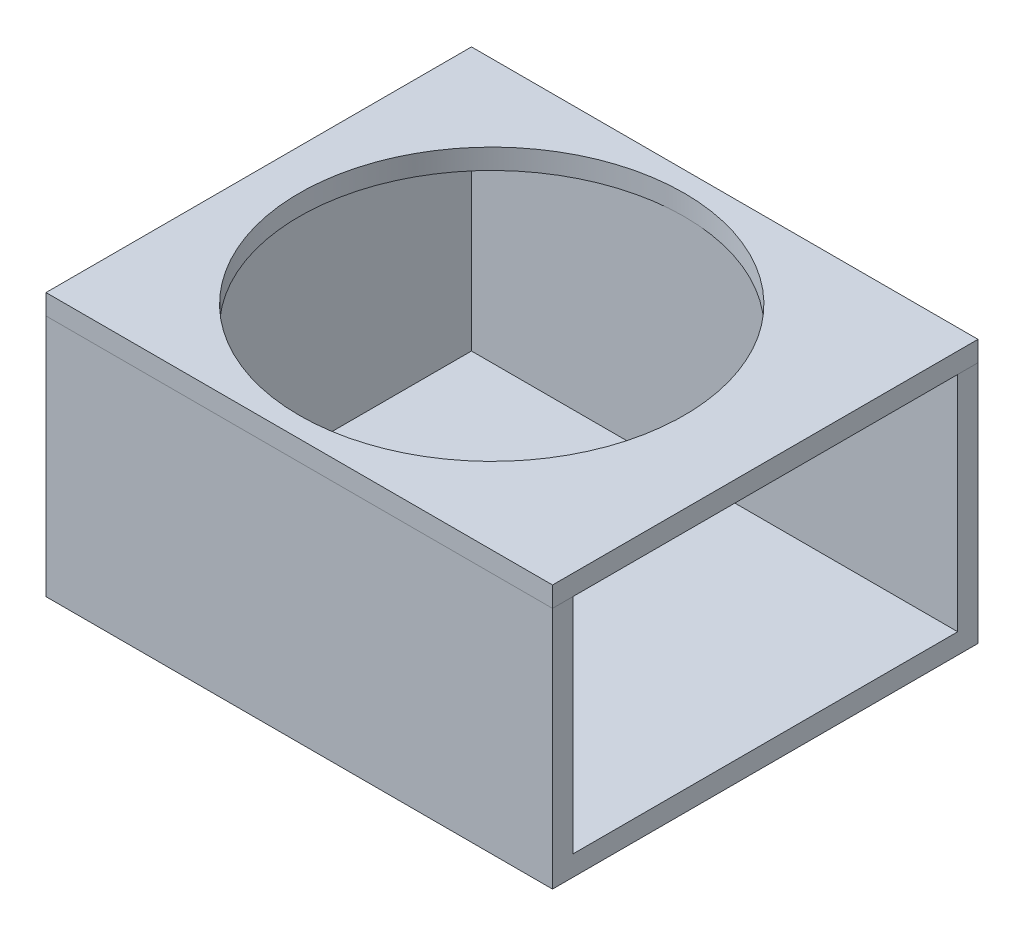
ISO-10303-21;
HEADER;
FILE_DESCRIPTION(('STEP AP214'),'2;1');
FILE_NAME('part.step','',(''),(''),'','','');
FILE_SCHEMA(('AUTOMOTIVE_DESIGN { 1 0 10303 214 1 1 1 1 }'));
ENDSEC;
DATA;
#1=APPLICATION_CONTEXT('core data for automotive mechanical design processes');
#2=APPLICATION_PROTOCOL_DEFINITION('international standard','automotive_design',2000,#1);
#3=PRODUCT_CONTEXT('',#1,'mechanical');
#4=PRODUCT('Part','Part','',(#3));
#5=PRODUCT_RELATED_PRODUCT_CATEGORY('part','',(#4));
#6=PRODUCT_DEFINITION_FORMATION('','',#4);
#7=PRODUCT_DEFINITION_CONTEXT('part definition',#1,'design');
#8=PRODUCT_DEFINITION('design','',#6,#7);
#9=PRODUCT_DEFINITION_SHAPE('','',#8);
#10=(LENGTH_UNIT() NAMED_UNIT(*) SI_UNIT(.MILLI.,.METRE.));
#11=(NAMED_UNIT(*) PLANE_ANGLE_UNIT() SI_UNIT($,.RADIAN.));
#12=(NAMED_UNIT(*) SI_UNIT($,.STERADIAN.) SOLID_ANGLE_UNIT());
#13=UNCERTAINTY_MEASURE_WITH_UNIT(LENGTH_MEASURE(1.E-05),#10,'distance_accuracy_value','');
#14=(GEOMETRIC_REPRESENTATION_CONTEXT(3) GLOBAL_UNCERTAINTY_ASSIGNED_CONTEXT((#13)) GLOBAL_UNIT_ASSIGNED_CONTEXT((#10,
#11,#12)) REPRESENTATION_CONTEXT('',''));
#15=CARTESIAN_POINT('',(0.,0.,0.));
#16=DIRECTION('',(0.,0.,1.));
#17=DIRECTION('',(1.,0.,0.));
#18=AXIS2_PLACEMENT_3D('',#15,#16,#17);
#19=CARTESIAN_POINT('',(-12.5,13.,10.5));
#20=DIRECTION('',(1.,0.,0.));
#21=DIRECTION('',(0.,0.,-1.));
#22=AXIS2_PLACEMENT_3D('',#19,#20,#21);
#23=PLANE('',#22);
#24=DIRECTION('',(0.,0.,1.));
#25=VECTOR('',#24,1.);
#26=CARTESIAN_POINT('',(-12.5,12.,10.5));
#27=LINE('',#26,#25);
#28=CARTESIAN_POINT('',(-12.5,12.,-10.5));
#29=VERTEX_POINT('',#28);
#30=CARTESIAN_POINT('',(-12.5,12.,10.5));
#31=VERTEX_POINT('',#30);
#32=EDGE_CURVE('E106',#29,#31,#27,.T.);
#33=ORIENTED_EDGE('',*,*,#32,.T.);
#34=DIRECTION('',(0.,-1.,0.));
#35=VECTOR('',#34,1.);
#36=CARTESIAN_POINT('',(-12.5,13.,10.5));
#37=LINE('',#36,#35);
#38=CARTESIAN_POINT('',(-12.5,13.,10.5));
#39=VERTEX_POINT('',#38);
#40=EDGE_CURVE('E12',#39,#31,#37,.T.);
#41=ORIENTED_EDGE('',*,*,#40,.F.);
#42=DIRECTION('',(0.,0.,1.));
#43=VECTOR('',#42,1.);
#44=CARTESIAN_POINT('',(-12.5,13.,10.5));
#45=LINE('',#44,#43);
#46=CARTESIAN_POINT('',(-12.5,13.,-10.5));
#47=VERTEX_POINT('',#46);
#48=EDGE_CURVE('E94',#47,#39,#45,.T.);
#49=ORIENTED_EDGE('',*,*,#48,.F.);
#50=DIRECTION('',(0.,-1.,0.));
#51=VECTOR('',#50,1.);
#52=CARTESIAN_POINT('',(-12.5,13.,-10.5));
#53=LINE('',#52,#51);
#54=EDGE_CURVE('E102',#47,#29,#53,.T.);
#55=ORIENTED_EDGE('',*,*,#54,.T.);
#56=EDGE_LOOP('',(#33,#41,#49,#55));
#57=FACE_BOUND('',#56,.T.);
#58=ADVANCED_FACE('F43',(#57),#23,.F.);
#59=CARTESIAN_POINT('',(12.5,13.,10.5));
#60=DIRECTION('',(0.,0.,-1.));
#61=DIRECTION('',(-1.,0.,0.));
#62=AXIS2_PLACEMENT_3D('',#59,#60,#61);
#63=PLANE('',#62);
#64=DIRECTION('',(1.,0.,0.));
#65=VECTOR('',#64,1.);
#66=CARTESIAN_POINT('',(12.5,12.,10.5));
#67=LINE('',#66,#65);
#68=CARTESIAN_POINT('',(12.5,12.,10.5));
#69=VERTEX_POINT('',#68);
#70=EDGE_CURVE('E98',#31,#69,#67,.T.);
#71=ORIENTED_EDGE('',*,*,#70,.T.);
#72=DIRECTION('',(0.,-1.,0.));
#73=VECTOR('',#72,1.);
#74=CARTESIAN_POINT('',(12.5,13.,10.5));
#75=LINE('',#74,#73);
#76=CARTESIAN_POINT('',(12.5,13.,10.5));
#77=VERTEX_POINT('',#76);
#78=EDGE_CURVE('E51',#77,#69,#75,.T.);
#79=ORIENTED_EDGE('',*,*,#78,.F.);
#80=DIRECTION('',(1.,0.,0.));
#81=VECTOR('',#80,1.);
#82=CARTESIAN_POINT('',(12.5,13.,10.5));
#83=LINE('',#82,#81);
#84=EDGE_CURVE('E89',#39,#77,#83,.T.);
#85=ORIENTED_EDGE('',*,*,#84,.F.);
#86=ORIENTED_EDGE('',*,*,#40,.T.);
#87=EDGE_LOOP('',(#71,#79,#85,#86));
#88=FACE_BOUND('',#87,.T.);
#89=ADVANCED_FACE('F97',(#88),#63,.F.);
#90=CARTESIAN_POINT('',(12.5,13.,10.5));
#91=DIRECTION('',(-1.,0.,0.));
#92=DIRECTION('',(0.,0.,1.));
#93=AXIS2_PLACEMENT_3D('',#90,#91,#92);
#94=PLANE('',#93);
#95=DIRECTION('',(0.,0.,-1.));
#96=VECTOR('',#95,1.);
#97=CARTESIAN_POINT('',(12.5,12.,10.5));
#98=LINE('',#97,#96);
#99=CARTESIAN_POINT('',(12.5,12.,-10.5));
#100=VERTEX_POINT('',#99);
#101=EDGE_CURVE('E76',#69,#100,#98,.T.);
#102=ORIENTED_EDGE('',*,*,#101,.T.);
#103=DIRECTION('',(0.,-1.,0.));
#104=VECTOR('',#103,1.);
#105=CARTESIAN_POINT('',(12.5,13.,-10.5));
#106=LINE('',#105,#104);
#107=CARTESIAN_POINT('',(12.5,13.,-10.5));
#108=VERTEX_POINT('',#107);
#109=EDGE_CURVE('E99',#108,#100,#106,.T.);
#110=ORIENTED_EDGE('',*,*,#109,.F.);
#111=DIRECTION('',(0.,0.,-1.));
#112=VECTOR('',#111,1.);
#113=CARTESIAN_POINT('',(12.5,13.,10.5));
#114=LINE('',#113,#112);
#115=EDGE_CURVE('E92',#77,#108,#114,.T.);
#116=ORIENTED_EDGE('',*,*,#115,.F.);
#117=ORIENTED_EDGE('',*,*,#78,.T.);
#118=EDGE_LOOP('',(#102,#110,#116,#117));
#119=FACE_BOUND('',#118,.T.);
#120=ADVANCED_FACE('F100',(#119),#94,.F.);
#121=CARTESIAN_POINT('',(12.5,13.,-10.5));
#122=DIRECTION('',(0.,0.,1.));
#123=DIRECTION('',(1.,0.,0.));
#124=AXIS2_PLACEMENT_3D('',#121,#122,#123);
#125=PLANE('',#124);
#126=DIRECTION('',(-1.,0.,0.));
#127=VECTOR('',#126,1.);
#128=CARTESIAN_POINT('',(12.5,12.,-10.5));
#129=LINE('',#128,#127);
#130=EDGE_CURVE('E82',#100,#29,#129,.T.);
#131=ORIENTED_EDGE('',*,*,#130,.T.);
#132=ORIENTED_EDGE('',*,*,#54,.F.);
#133=DIRECTION('',(-1.,0.,0.));
#134=VECTOR('',#133,1.);
#135=CARTESIAN_POINT('',(12.5,13.,-10.5));
#136=LINE('',#135,#134);
#137=EDGE_CURVE('E59',#108,#47,#136,.T.);
#138=ORIENTED_EDGE('',*,*,#137,.F.);
#139=ORIENTED_EDGE('',*,*,#109,.T.);
#140=EDGE_LOOP('',(#131,#132,#138,#139));
#141=FACE_BOUND('',#140,.T.);
#142=ADVANCED_FACE('F114',(#141),#125,.F.);
#143=CARTESIAN_POINT('',(0.,13.,0.));
#144=DIRECTION('',(0.,1.,0.));
#145=DIRECTION('',(0.,0.,1.));
#146=AXIS2_PLACEMENT_3D('',#143,#144,#145);
#147=PLANE('',#146);
#148=CARTESIAN_POINT('',(-1.,13.,0.));
#149=DIRECTION('',(0.,1.,0.));
#150=DIRECTION('',(0.,0.,1.));
#151=AXIS2_PLACEMENT_3D('',#148,#149,#150);
#152=CIRCLE('',#151,9.5);
#153=CARTESIAN_POINT('',(-1.,13.,9.5));
#154=VERTEX_POINT('',#153);
#155=EDGE_CURVE('E120',#154,#154,#152,.T.);
#156=ORIENTED_EDGE('',*,*,#155,.F.);
#157=EDGE_LOOP('',(#156));
#158=FACE_BOUND('',#157,.T.);
#159=ORIENTED_EDGE('',*,*,#48,.T.);
#160=ORIENTED_EDGE('',*,*,#84,.T.);
#161=ORIENTED_EDGE('',*,*,#115,.T.);
#162=ORIENTED_EDGE('',*,*,#137,.T.);
#163=EDGE_LOOP('',(#159,#160,#161,#162));
#164=FACE_BOUND('',#163,.T.);
#165=ADVANCED_FACE('F90',(#158,#164),#147,.T.);
#166=CARTESIAN_POINT('',(0.,12.,0.));
#167=DIRECTION('',(0.,1.,0.));
#168=DIRECTION('',(0.,0.,1.));
#169=AXIS2_PLACEMENT_3D('',#166,#167,#168);
#170=PLANE('',#169);
#171=CARTESIAN_POINT('',(-1.,12.,0.));
#172=DIRECTION('',(0.,1.,0.));
#173=DIRECTION('',(0.,0.,1.));
#174=AXIS2_PLACEMENT_3D('',#171,#172,#173);
#175=CIRCLE('',#174,9.5);
#176=CARTESIAN_POINT('',(-1.,12.,9.5));
#177=VERTEX_POINT('',#176);
#178=EDGE_CURVE('E109',#177,#177,#175,.T.);
#179=ORIENTED_EDGE('',*,*,#178,.T.);
#180=EDGE_LOOP('',(#179));
#181=FACE_BOUND('',#180,.T.);
#182=ORIENTED_EDGE('',*,*,#32,.F.);
#183=ORIENTED_EDGE('',*,*,#130,.F.);
#184=ORIENTED_EDGE('',*,*,#101,.F.);
#185=ORIENTED_EDGE('',*,*,#70,.F.);
#186=EDGE_LOOP('',(#182,#183,#184,#185));
#187=FACE_BOUND('',#186,.T.);
#188=ADVANCED_FACE('F117',(#181,#187),#170,.F.);
#189=CARTESIAN_POINT('',(-1.,12.,0.));
#190=DIRECTION('',(0.,1.,0.));
#191=DIRECTION('',(0.,0.,1.));
#192=AXIS2_PLACEMENT_3D('',#189,#190,#191);
#193=CYLINDRICAL_SURFACE('',#192,9.5);
#194=ORIENTED_EDGE('',*,*,#178,.F.);
#195=EDGE_LOOP('',(#194));
#196=FACE_BOUND('',#195,.T.);
#197=ORIENTED_EDGE('',*,*,#155,.T.);
#198=EDGE_LOOP('',(#197));
#199=FACE_BOUND('',#198,.T.);
#200=ADVANCED_FACE('F127',(#196,#199),#193,.F.);
#201=CLOSED_SHELL('',(#58,#89,#120,#142,#165,#188,#200));
#202=MANIFOLD_SOLID_BREP('B2',#201);
#203=CARTESIAN_POINT('',(12.5,12.,10.5));
#204=DIRECTION('',(-1.,0.,0.));
#205=DIRECTION('',(0.,0.,1.));
#206=AXIS2_PLACEMENT_3D('',#203,#204,#205);
#207=PLANE('',#206);
#208=DIRECTION('',(0.,-1.,0.));
#209=VECTOR('',#208,1.);
#210=CARTESIAN_POINT('',(12.5,12.,9.5));
#211=LINE('',#210,#209);
#212=CARTESIAN_POINT('',(12.5,12.,9.5));
#213=VERTEX_POINT('',#212);
#214=CARTESIAN_POINT('',(12.5,1.,9.5));
#215=VERTEX_POINT('',#214);
#216=EDGE_CURVE('E286',#213,#215,#211,.T.);
#217=ORIENTED_EDGE('',*,*,#216,.F.);
#218=DIRECTION('',(0.,0.,-1.));
#219=VECTOR('',#218,1.);
#220=CARTESIAN_POINT('',(12.5,12.,10.5));
#221=LINE('',#220,#219);
#222=CARTESIAN_POINT('',(12.5,12.,10.5));
#223=VERTEX_POINT('',#222);
#224=EDGE_CURVE('E296',#223,#213,#221,.T.);
#225=ORIENTED_EDGE('',*,*,#224,.F.);
#226=DIRECTION('',(0.,-1.,0.));
#227=VECTOR('',#226,1.);
#228=CARTESIAN_POINT('',(12.5,12.,10.5));
#229=LINE('',#228,#227);
#230=CARTESIAN_POINT('',(12.5,0.,10.5));
#231=VERTEX_POINT('',#230);
#232=EDGE_CURVE('E313',#223,#231,#229,.T.);
#233=ORIENTED_EDGE('',*,*,#232,.T.);
#234=DIRECTION('',(0.,0.,-1.));
#235=VECTOR('',#234,1.);
#236=CARTESIAN_POINT('',(12.5,0.,10.5));
#237=LINE('',#236,#235);
#238=CARTESIAN_POINT('',(12.5,0.,-10.5));
#239=VERTEX_POINT('',#238);
#240=EDGE_CURVE('E305',#231,#239,#237,.T.);
#241=ORIENTED_EDGE('',*,*,#240,.T.);
#242=DIRECTION('',(0.,-1.,0.));
#243=VECTOR('',#242,1.);
#244=CARTESIAN_POINT('',(12.5,12.,-10.5));
#245=LINE('',#244,#243);
#246=CARTESIAN_POINT('',(12.5,12.,-10.5));
#247=VERTEX_POINT('',#246);
#248=EDGE_CURVE('E310',#247,#239,#245,.T.);
#249=ORIENTED_EDGE('',*,*,#248,.F.);
#250=CARTESIAN_POINT('',(12.5,12.,-9.49999999999999));
#251=VERTEX_POINT('',#250);
#252=EDGE_CURVE('E295',#251,#247,#221,.T.);
#253=ORIENTED_EDGE('',*,*,#252,.F.);
#254=DIRECTION('',(0.,1.,0.));
#255=VECTOR('',#254,1.);
#256=CARTESIAN_POINT('',(12.5,12.,-9.5));
#257=LINE('',#256,#255);
#258=CARTESIAN_POINT('',(12.5,1.,-9.5));
#259=VERTEX_POINT('',#258);
#260=EDGE_CURVE('E275',#259,#251,#257,.T.);
#261=ORIENTED_EDGE('',*,*,#260,.F.);
#262=DIRECTION('',(0.,0.,-1.));
#263=VECTOR('',#262,1.);
#264=CARTESIAN_POINT('',(12.5,1.,10.5));
#265=LINE('',#264,#263);
#266=EDGE_CURVE('E41',#215,#259,#265,.T.);
#267=ORIENTED_EDGE('',*,*,#266,.F.);
#268=EDGE_LOOP('',(#217,#225,#233,#241,#249,#253,#261,#267));
#269=FACE_BOUND('',#268,.T.);
#270=ADVANCED_FACE('F188',(#269),#207,.F.);
#271=CARTESIAN_POINT('',(0.,12.,0.));
#272=DIRECTION('',(0.,1.,0.));
#273=DIRECTION('',(0.,0.,1.));
#274=AXIS2_PLACEMENT_3D('',#271,#272,#273);
#275=PLANE('',#274);
#276=ORIENTED_EDGE('',*,*,#224,.T.);
#277=DIRECTION('',(1.,0.,0.));
#278=VECTOR('',#277,1.);
#279=CARTESIAN_POINT('',(-11.5,12.,9.5));
#280=LINE('',#279,#278);
#281=CARTESIAN_POINT('',(-1.,12.,9.5));
#282=VERTEX_POINT('',#281);
#283=EDGE_CURVE('E203',#282,#213,#280,.T.);
#284=ORIENTED_EDGE('',*,*,#283,.F.);
#285=CARTESIAN_POINT('',(-11.5,12.,9.5));
#286=VERTEX_POINT('',#285);
#287=EDGE_CURVE('E272',#286,#282,#280,.T.);
#288=ORIENTED_EDGE('',*,*,#287,.F.);
#289=DIRECTION('',(0.,0.,1.));
#290=VECTOR('',#289,1.);
#291=CARTESIAN_POINT('',(-11.5,12.,-9.5));
#292=LINE('',#291,#290);
#293=CARTESIAN_POINT('',(-11.5,12.,-9.5));
#294=VERTEX_POINT('',#293);
#295=EDGE_CURVE('E260',#294,#286,#292,.T.);
#296=ORIENTED_EDGE('',*,*,#295,.F.);
#297=DIRECTION('',(1.,0.,0.));
#298=VECTOR('',#297,1.);
#299=CARTESIAN_POINT('',(0.,12.,-9.5));
#300=LINE('',#299,#298);
#301=CARTESIAN_POINT('',(-1.,12.,-9.5));
#302=VERTEX_POINT('',#301);
#303=EDGE_CURVE('E196',#294,#302,#300,.T.);
#304=ORIENTED_EDGE('',*,*,#303,.T.);
#305=EDGE_CURVE('E211',#302,#251,#300,.T.);
#306=ORIENTED_EDGE('',*,*,#305,.T.);
#307=ORIENTED_EDGE('',*,*,#252,.T.);
#308=DIRECTION('',(-1.,0.,0.));
#309=VECTOR('',#308,1.);
#310=CARTESIAN_POINT('',(12.5,12.,-10.5));
#311=LINE('',#310,#309);
#312=CARTESIAN_POINT('',(-12.5,12.,-10.5));
#313=VERTEX_POINT('',#312);
#314=EDGE_CURVE('E298',#247,#313,#311,.T.);
#315=ORIENTED_EDGE('',*,*,#314,.T.);
#316=DIRECTION('',(0.,0.,1.));
#317=VECTOR('',#316,1.);
#318=CARTESIAN_POINT('',(-12.5,12.,10.5));
#319=LINE('',#318,#317);
#320=CARTESIAN_POINT('',(-12.5,12.,10.5));
#321=VERTEX_POINT('',#320);
#322=EDGE_CURVE('E289',#313,#321,#319,.T.);
#323=ORIENTED_EDGE('',*,*,#322,.T.);
#324=DIRECTION('',(1.,0.,0.));
#325=VECTOR('',#324,1.);
#326=CARTESIAN_POINT('',(12.5,12.,10.5));
#327=LINE('',#326,#325);
#328=EDGE_CURVE('E292',#321,#223,#327,.T.);
#329=ORIENTED_EDGE('',*,*,#328,.T.);
#330=EDGE_LOOP('',(#276,#284,#288,#296,#304,#306,#307,#315,#323,#329));
#331=FACE_BOUND('',#330,.T.);
#332=ADVANCED_FACE('F277',(#331),#275,.T.);
#333=CARTESIAN_POINT('',(-12.5,12.,10.5));
#334=DIRECTION('',(1.,0.,0.));
#335=DIRECTION('',(0.,0.,-1.));
#336=AXIS2_PLACEMENT_3D('',#333,#334,#335);
#337=PLANE('',#336);
#338=DIRECTION('',(0.,0.,1.));
#339=VECTOR('',#338,1.);
#340=CARTESIAN_POINT('',(-12.5,0.,10.5));
#341=LINE('',#340,#339);
#342=CARTESIAN_POINT('',(-12.5,0.,-10.5));
#343=VERTEX_POINT('',#342);
#344=CARTESIAN_POINT('',(-12.5,0.,10.5));
#345=VERTEX_POINT('',#344);
#346=EDGE_CURVE('E288',#343,#345,#341,.T.);
#347=ORIENTED_EDGE('',*,*,#346,.T.);
#348=DIRECTION('',(0.,-1.,0.));
#349=VECTOR('',#348,1.);
#350=CARTESIAN_POINT('',(-12.5,12.,10.5));
#351=LINE('',#350,#349);
#352=EDGE_CURVE('E316',#321,#345,#351,.T.);
#353=ORIENTED_EDGE('',*,*,#352,.F.);
#354=ORIENTED_EDGE('',*,*,#322,.F.);
#355=DIRECTION('',(0.,-1.,0.));
#356=VECTOR('',#355,1.);
#357=CARTESIAN_POINT('',(-12.5,12.,-10.5));
#358=LINE('',#357,#356);
#359=EDGE_CURVE('E300',#313,#343,#358,.T.);
#360=ORIENTED_EDGE('',*,*,#359,.T.);
#361=EDGE_LOOP('',(#347,#353,#354,#360));
#362=FACE_BOUND('',#361,.T.);
#363=ADVANCED_FACE('F190',(#362),#337,.F.);
#364=CARTESIAN_POINT('',(12.5,12.,10.5));
#365=DIRECTION('',(0.,0.,-1.));
#366=DIRECTION('',(-1.,0.,0.));
#367=AXIS2_PLACEMENT_3D('',#364,#365,#366);
#368=PLANE('',#367);
#369=DIRECTION('',(1.,0.,0.));
#370=VECTOR('',#369,1.);
#371=CARTESIAN_POINT('',(12.5,0.,10.5));
#372=LINE('',#371,#370);
#373=EDGE_CURVE('E303',#345,#231,#372,.T.);
#374=ORIENTED_EDGE('',*,*,#373,.T.);
#375=ORIENTED_EDGE('',*,*,#232,.F.);
#376=ORIENTED_EDGE('',*,*,#328,.F.);
#377=ORIENTED_EDGE('',*,*,#352,.T.);
#378=EDGE_LOOP('',(#374,#375,#376,#377));
#379=FACE_BOUND('',#378,.T.);
#380=ADVANCED_FACE('F338',(#379),#368,.F.);
#381=CARTESIAN_POINT('',(12.5,12.,-10.5));
#382=DIRECTION('',(0.,0.,1.));
#383=DIRECTION('',(1.,0.,0.));
#384=AXIS2_PLACEMENT_3D('',#381,#382,#383);
#385=PLANE('',#384);
#386=DIRECTION('',(-1.,0.,0.));
#387=VECTOR('',#386,1.);
#388=CARTESIAN_POINT('',(12.5,0.,-10.5));
#389=LINE('',#388,#387);
#390=EDGE_CURVE('E293',#239,#343,#389,.T.);
#391=ORIENTED_EDGE('',*,*,#390,.T.);
#392=ORIENTED_EDGE('',*,*,#359,.F.);
#393=ORIENTED_EDGE('',*,*,#314,.F.);
#394=ORIENTED_EDGE('',*,*,#248,.T.);
#395=EDGE_LOOP('',(#391,#392,#393,#394));
#396=FACE_BOUND('',#395,.T.);
#397=ADVANCED_FACE('F331',(#396),#385,.F.);
#398=CARTESIAN_POINT('',(0.,0.,0.));
#399=DIRECTION('',(0.,1.,0.));
#400=DIRECTION('',(0.,0.,1.));
#401=AXIS2_PLACEMENT_3D('',#398,#399,#400);
#402=PLANE('',#401);
#403=ORIENTED_EDGE('',*,*,#346,.F.);
#404=ORIENTED_EDGE('',*,*,#390,.F.);
#405=ORIENTED_EDGE('',*,*,#240,.F.);
#406=ORIENTED_EDGE('',*,*,#373,.F.);
#407=EDGE_LOOP('',(#403,#404,#405,#406));
#408=FACE_BOUND('',#407,.T.);
#409=ADVANCED_FACE('F343',(#408),#402,.F.);
#410=CARTESIAN_POINT('',(0.,1.,0.));
#411=DIRECTION('',(0.,1.,0.));
#412=DIRECTION('',(0.,0.,1.));
#413=AXIS2_PLACEMENT_3D('',#410,#411,#412);
#414=PLANE('',#413);
#415=ORIENTED_EDGE('',*,*,#266,.T.);
#416=DIRECTION('',(-1.,0.,0.));
#417=VECTOR('',#416,1.);
#418=CARTESIAN_POINT('',(-11.5,1.,-9.5));
#419=LINE('',#418,#417);
#420=CARTESIAN_POINT('',(-11.5,1.,-9.5));
#421=VERTEX_POINT('',#420);
#422=EDGE_CURVE('E268',#259,#421,#419,.T.);
#423=ORIENTED_EDGE('',*,*,#422,.T.);
#424=DIRECTION('',(0.,0.,1.));
#425=VECTOR('',#424,1.);
#426=CARTESIAN_POINT('',(-11.5,1.,-9.5));
#427=LINE('',#426,#425);
#428=CARTESIAN_POINT('',(-11.5,1.,9.5));
#429=VERTEX_POINT('',#428);
#430=EDGE_CURVE('E281',#421,#429,#427,.T.);
#431=ORIENTED_EDGE('',*,*,#430,.T.);
#432=DIRECTION('',(1.,0.,0.));
#433=VECTOR('',#432,1.);
#434=CARTESIAN_POINT('',(-11.5,1.,9.5));
#435=LINE('',#434,#433);
#436=EDGE_CURVE('E274',#429,#215,#435,.T.);
#437=ORIENTED_EDGE('',*,*,#436,.T.);
#438=EDGE_LOOP('',(#415,#423,#431,#437));
#439=FACE_BOUND('',#438,.T.);
#440=ADVANCED_FACE('F341',(#439),#414,.T.);
#441=CARTESIAN_POINT('',(-11.5,12.,9.5));
#442=DIRECTION('',(0.,0.,-1.));
#443=DIRECTION('',(-1.,0.,0.));
#444=AXIS2_PLACEMENT_3D('',#441,#442,#443);
#445=PLANE('',#444);
#446=ORIENTED_EDGE('',*,*,#216,.T.);
#447=ORIENTED_EDGE('',*,*,#436,.F.);
#448=DIRECTION('',(0.,-1.,0.));
#449=VECTOR('',#448,1.);
#450=CARTESIAN_POINT('',(-11.5,12.,9.5));
#451=LINE('',#450,#449);
#452=EDGE_CURVE('E264',#286,#429,#451,.T.);
#453=ORIENTED_EDGE('',*,*,#452,.F.);
#454=ORIENTED_EDGE('',*,*,#287,.T.);
#455=ORIENTED_EDGE('',*,*,#283,.T.);
#456=EDGE_LOOP('',(#446,#447,#453,#454,#455));
#457=FACE_BOUND('',#456,.T.);
#458=ADVANCED_FACE('F271',(#457),#445,.T.);
#459=CARTESIAN_POINT('',(-11.5,12.,-9.5));
#460=DIRECTION('',(0.,0.,1.));
#461=DIRECTION('',(1.,0.,0.));
#462=AXIS2_PLACEMENT_3D('',#459,#460,#461);
#463=PLANE('',#462);
#464=ORIENTED_EDGE('',*,*,#260,.T.);
#465=ORIENTED_EDGE('',*,*,#305,.F.);
#466=ORIENTED_EDGE('',*,*,#303,.F.);
#467=DIRECTION('',(0.,-1.,0.));
#468=VECTOR('',#467,1.);
#469=CARTESIAN_POINT('',(-11.5,12.,-9.5));
#470=LINE('',#469,#468);
#471=EDGE_CURVE('E267',#294,#421,#470,.T.);
#472=ORIENTED_EDGE('',*,*,#471,.T.);
#473=ORIENTED_EDGE('',*,*,#422,.F.);
#474=EDGE_LOOP('',(#464,#465,#466,#472,#473));
#475=FACE_BOUND('',#474,.T.);
#476=ADVANCED_FACE('F322',(#475),#463,.T.);
#477=CARTESIAN_POINT('',(-11.5,12.,-9.5));
#478=DIRECTION('',(1.,0.,0.));
#479=DIRECTION('',(0.,0.,-1.));
#480=AXIS2_PLACEMENT_3D('',#477,#478,#479);
#481=PLANE('',#480);
#482=ORIENTED_EDGE('',*,*,#430,.F.);
#483=ORIENTED_EDGE('',*,*,#471,.F.);
#484=ORIENTED_EDGE('',*,*,#295,.T.);
#485=ORIENTED_EDGE('',*,*,#452,.T.);
#486=EDGE_LOOP('',(#482,#483,#484,#485));
#487=FACE_BOUND('',#486,.T.);
#488=ADVANCED_FACE('F263',(#487),#481,.T.);
#489=CLOSED_SHELL('',(#270,#332,#363,#380,#397,#409,#440,#458,#476,#488));
#490=MANIFOLD_SOLID_BREP('B6',#489);
#491=ADVANCED_BREP_SHAPE_REPRESENTATION('',(#18,#202,#490),#14);
#492=SHAPE_DEFINITION_REPRESENTATION(#9,#491);
ENDSEC;
END-ISO-10303-21;
